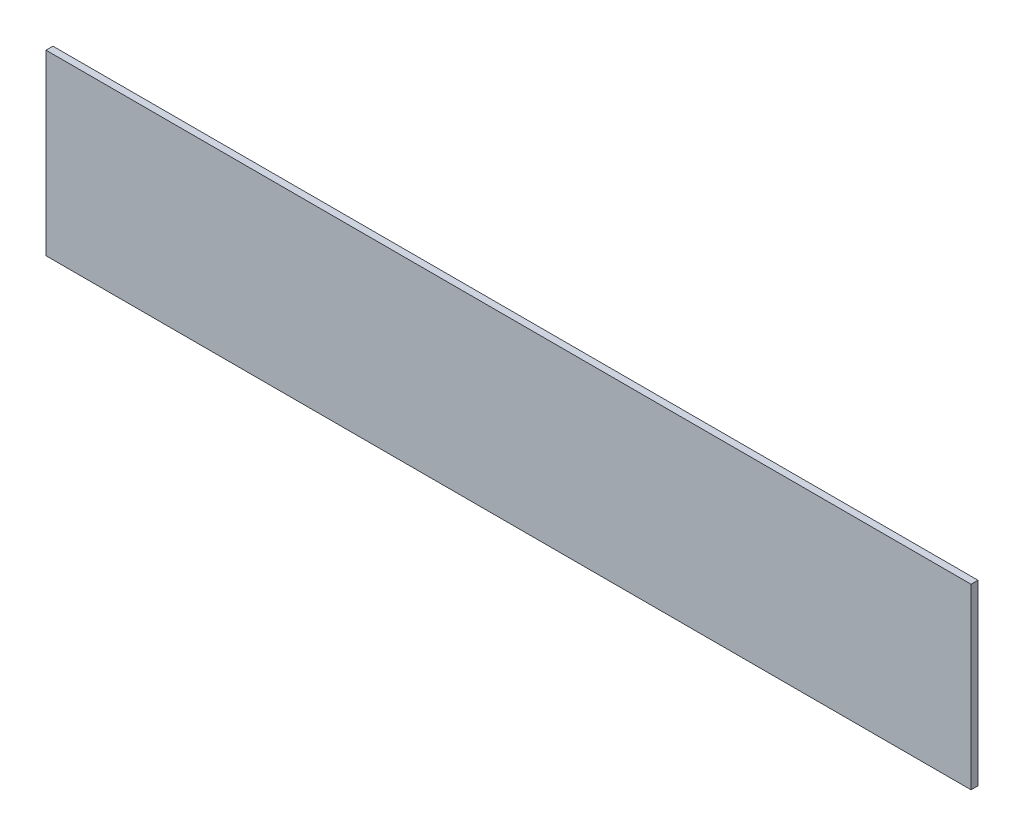
ISO-10303-21;
HEADER;
FILE_DESCRIPTION(('STEP AP214'),'2;1');
FILE_NAME('part.step','',(''),(''),'','','');
FILE_SCHEMA(('AUTOMOTIVE_DESIGN { 1 0 10303 214 1 1 1 1 }'));
ENDSEC;
DATA;
#1=APPLICATION_CONTEXT('core data for automotive mechanical design processes');
#2=APPLICATION_PROTOCOL_DEFINITION('international standard','automotive_design',2000,#1);
#3=PRODUCT_CONTEXT('',#1,'mechanical');
#4=PRODUCT('Part','Part','',(#3));
#5=PRODUCT_RELATED_PRODUCT_CATEGORY('part','',(#4));
#6=PRODUCT_DEFINITION_FORMATION('','',#4);
#7=PRODUCT_DEFINITION_CONTEXT('part definition',#1,'design');
#8=PRODUCT_DEFINITION('design','',#6,#7);
#9=PRODUCT_DEFINITION_SHAPE('','',#8);
#10=(LENGTH_UNIT() NAMED_UNIT(*) SI_UNIT(.MILLI.,.METRE.));
#11=(NAMED_UNIT(*) PLANE_ANGLE_UNIT() SI_UNIT($,.RADIAN.));
#12=(NAMED_UNIT(*) SI_UNIT($,.STERADIAN.) SOLID_ANGLE_UNIT());
#13=UNCERTAINTY_MEASURE_WITH_UNIT(LENGTH_MEASURE(1.E-05),#10,'distance_accuracy_value','');
#14=(GEOMETRIC_REPRESENTATION_CONTEXT(3) GLOBAL_UNCERTAINTY_ASSIGNED_CONTEXT((#13)) GLOBAL_UNIT_ASSIGNED_CONTEXT((#10,
#11,#12)) REPRESENTATION_CONTEXT('',''));
#15=CARTESIAN_POINT('',(0.,0.,0.));
#16=DIRECTION('',(0.,0.,1.));
#17=DIRECTION('',(1.,0.,0.));
#18=AXIS2_PLACEMENT_3D('',#15,#16,#17);
#19=CARTESIAN_POINT('',(-167.48786251946,-68.9655797101449,3.));
#20=DIRECTION('',(1.,0.,0.));
#21=DIRECTION('',(0.,1.,0.));
#22=AXIS2_PLACEMENT_3D('',#19,#20,#21);
#23=PLANE('',#22);
#24=DIRECTION('',(0.,-1.,0.));
#25=VECTOR('',#24,1.);
#26=CARTESIAN_POINT('',(-167.48786251946,-68.9655797101449,0.));
#27=LINE('',#26,#25);
#28=CARTESIAN_POINT('',(-167.48786251946,-68.9655797101449,0.));
#29=VERTEX_POINT('',#28);
#30=CARTESIAN_POINT('',(-167.48786251946,-145.965579710145,0.));
#31=VERTEX_POINT('',#30);
#32=EDGE_CURVE('E107',#29,#31,#27,.T.);
#33=ORIENTED_EDGE('',*,*,#32,.T.);
#34=DIRECTION('',(0.,0.,-1.));
#35=VECTOR('',#34,1.);
#36=CARTESIAN_POINT('',(-167.48786251946,-145.965579710145,3.));
#37=LINE('',#36,#35);
#38=CARTESIAN_POINT('',(-167.48786251946,-145.965579710145,3.));
#39=VERTEX_POINT('',#38);
#40=EDGE_CURVE('E11',#39,#31,#37,.T.);
#41=ORIENTED_EDGE('',*,*,#40,.F.);
#42=DIRECTION('',(0.,-1.,0.));
#43=VECTOR('',#42,1.);
#44=CARTESIAN_POINT('',(-167.48786251946,-68.9655797101449,3.));
#45=LINE('',#44,#43);
#46=CARTESIAN_POINT('',(-167.48786251946,-68.9655797101449,3.));
#47=VERTEX_POINT('',#46);
#48=EDGE_CURVE('E91',#47,#39,#45,.T.);
#49=ORIENTED_EDGE('',*,*,#48,.F.);
#50=DIRECTION('',(0.,0.,-1.));
#51=VECTOR('',#50,1.);
#52=CARTESIAN_POINT('',(-167.48786251946,-68.9655797101449,3.));
#53=LINE('',#52,#51);
#54=EDGE_CURVE('E103',#47,#29,#53,.T.);
#55=ORIENTED_EDGE('',*,*,#54,.T.);
#56=EDGE_LOOP('',(#33,#41,#49,#55));
#57=FACE_BOUND('',#56,.T.);
#58=ADVANCED_FACE('F39',(#57),#23,.F.);
#59=CARTESIAN_POINT('',(-167.48786251946,-145.965579710145,3.));
#60=DIRECTION('',(0.,1.,0.));
#61=DIRECTION('',(0.,0.,1.));
#62=AXIS2_PLACEMENT_3D('',#59,#60,#61);
#63=PLANE('',#62);
#64=DIRECTION('',(1.,0.,0.));
#65=VECTOR('',#64,1.);
#66=CARTESIAN_POINT('',(-167.48786251946,-145.965579710145,0.));
#67=LINE('',#66,#65);
#68=CARTESIAN_POINT('',(232.51213748054,-145.965579710145,0.));
#69=VERTEX_POINT('',#68);
#70=EDGE_CURVE('E96',#31,#69,#67,.T.);
#71=ORIENTED_EDGE('',*,*,#70,.T.);
#72=DIRECTION('',(0.,0.,-1.));
#73=VECTOR('',#72,1.);
#74=CARTESIAN_POINT('',(232.51213748054,-145.965579710145,3.));
#75=LINE('',#74,#73);
#76=CARTESIAN_POINT('',(232.51213748054,-145.965579710145,3.));
#77=VERTEX_POINT('',#76);
#78=EDGE_CURVE('E48',#77,#69,#75,.T.);
#79=ORIENTED_EDGE('',*,*,#78,.F.);
#80=DIRECTION('',(1.,0.,0.));
#81=VECTOR('',#80,1.);
#82=CARTESIAN_POINT('',(-167.48786251946,-145.965579710145,3.));
#83=LINE('',#82,#81);
#84=EDGE_CURVE('E86',#39,#77,#83,.T.);
#85=ORIENTED_EDGE('',*,*,#84,.F.);
#86=ORIENTED_EDGE('',*,*,#40,.T.);
#87=EDGE_LOOP('',(#71,#79,#85,#86));
#88=FACE_BOUND('',#87,.T.);
#89=ADVANCED_FACE('F95',(#88),#63,.F.);
#90=CARTESIAN_POINT('',(232.51213748054,-68.9655797101449,3.));
#91=DIRECTION('',(-1.,0.,0.));
#92=DIRECTION('',(0.,-1.,0.));
#93=AXIS2_PLACEMENT_3D('',#90,#91,#92);
#94=PLANE('',#93);
#95=DIRECTION('',(0.,1.,0.));
#96=VECTOR('',#95,1.);
#97=CARTESIAN_POINT('',(232.51213748054,-68.9655797101449,0.));
#98=LINE('',#97,#96);
#99=CARTESIAN_POINT('',(232.51213748054,-68.9655797101449,0.));
#100=VERTEX_POINT('',#99);
#101=EDGE_CURVE('E73',#69,#100,#98,.T.);
#102=ORIENTED_EDGE('',*,*,#101,.T.);
#103=DIRECTION('',(0.,0.,-1.));
#104=VECTOR('',#103,1.);
#105=CARTESIAN_POINT('',(232.51213748054,-68.9655797101449,3.));
#106=LINE('',#105,#104);
#107=CARTESIAN_POINT('',(232.51213748054,-68.9655797101449,3.));
#108=VERTEX_POINT('',#107);
#109=EDGE_CURVE('E98',#108,#100,#106,.T.);
#110=ORIENTED_EDGE('',*,*,#109,.F.);
#111=DIRECTION('',(0.,1.,0.));
#112=VECTOR('',#111,1.);
#113=CARTESIAN_POINT('',(232.51213748054,-68.9655797101449,3.));
#114=LINE('',#113,#112);
#115=EDGE_CURVE('E89',#77,#108,#114,.T.);
#116=ORIENTED_EDGE('',*,*,#115,.F.);
#117=ORIENTED_EDGE('',*,*,#78,.T.);
#118=EDGE_LOOP('',(#102,#110,#116,#117));
#119=FACE_BOUND('',#118,.T.);
#120=ADVANCED_FACE('F99',(#119),#94,.F.);
#121=CARTESIAN_POINT('',(-167.48786251946,-68.9655797101449,3.));
#122=DIRECTION('',(0.,-1.,0.));
#123=DIRECTION('',(0.,0.,-1.));
#124=AXIS2_PLACEMENT_3D('',#121,#122,#123);
#125=PLANE('',#124);
#126=DIRECTION('',(-1.,0.,0.));
#127=VECTOR('',#126,1.);
#128=CARTESIAN_POINT('',(-167.48786251946,-68.9655797101449,0.));
#129=LINE('',#128,#127);
#130=EDGE_CURVE('E79',#100,#29,#129,.T.);
#131=ORIENTED_EDGE('',*,*,#130,.T.);
#132=ORIENTED_EDGE('',*,*,#54,.F.);
#133=DIRECTION('',(-1.,0.,0.));
#134=VECTOR('',#133,1.);
#135=CARTESIAN_POINT('',(-167.48786251946,-68.9655797101449,3.));
#136=LINE('',#135,#134);
#137=EDGE_CURVE('E56',#108,#47,#136,.T.);
#138=ORIENTED_EDGE('',*,*,#137,.F.);
#139=ORIENTED_EDGE('',*,*,#109,.T.);
#140=EDGE_LOOP('',(#131,#132,#138,#139));
#141=FACE_BOUND('',#140,.T.);
#142=ADVANCED_FACE('F120',(#141),#125,.F.);
#143=CARTESIAN_POINT('',(0.,0.,3.));
#144=DIRECTION('',(0.,0.,1.));
#145=DIRECTION('',(1.,0.,0.));
#146=AXIS2_PLACEMENT_3D('',#143,#144,#145);
#147=PLANE('',#146);
#148=ORIENTED_EDGE('',*,*,#48,.T.);
#149=ORIENTED_EDGE('',*,*,#84,.T.);
#150=ORIENTED_EDGE('',*,*,#115,.T.);
#151=ORIENTED_EDGE('',*,*,#137,.T.);
#152=EDGE_LOOP('',(#148,#149,#150,#151));
#153=FACE_BOUND('',#152,.T.);
#154=ADVANCED_FACE('F87',(#153),#147,.T.);
#155=CARTESIAN_POINT('',(0.,0.,0.));
#156=DIRECTION('',(0.,0.,1.));
#157=DIRECTION('',(1.,0.,0.));
#158=AXIS2_PLACEMENT_3D('',#155,#156,#157);
#159=PLANE('',#158);
#160=ORIENTED_EDGE('',*,*,#32,.F.);
#161=ORIENTED_EDGE('',*,*,#130,.F.);
#162=ORIENTED_EDGE('',*,*,#101,.F.);
#163=ORIENTED_EDGE('',*,*,#70,.F.);
#164=EDGE_LOOP('',(#160,#161,#162,#163));
#165=FACE_BOUND('',#164,.T.);
#166=ADVANCED_FACE('F123',(#165),#159,.F.);
#167=CLOSED_SHELL('',(#58,#89,#120,#142,#154,#166));
#168=MANIFOLD_SOLID_BREP('B2',#167);
#169=ADVANCED_BREP_SHAPE_REPRESENTATION('',(#18,#168),#14);
#170=SHAPE_DEFINITION_REPRESENTATION(#9,#169);
ENDSEC;
END-ISO-10303-21;
